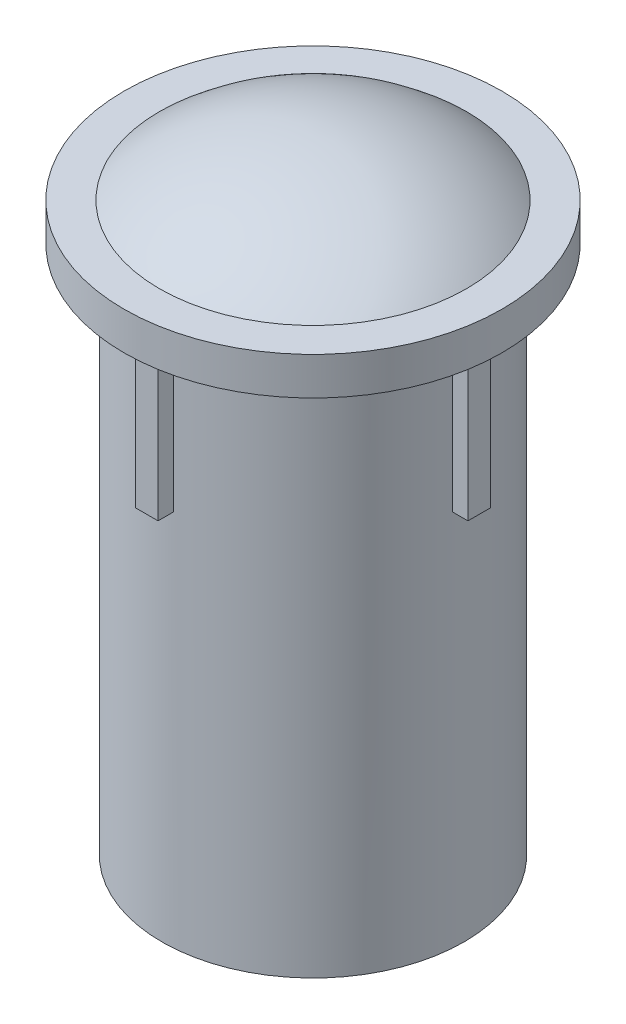
ISO-10303-21;
HEADER;
FILE_DESCRIPTION(('STEP AP214'),'2;1');
FILE_NAME('part.step','',(''),(''),'','','');
FILE_SCHEMA(('AUTOMOTIVE_DESIGN { 1 0 10303 214 1 1 1 1 }'));
ENDSEC;
DATA;
#1=APPLICATION_CONTEXT('core data for automotive mechanical design processes');
#2=APPLICATION_PROTOCOL_DEFINITION('international standard','automotive_design',2000,#1);
#3=PRODUCT_CONTEXT('',#1,'mechanical');
#4=PRODUCT('Part','Part','',(#3));
#5=PRODUCT_RELATED_PRODUCT_CATEGORY('part','',(#4));
#6=PRODUCT_DEFINITION_FORMATION('','',#4);
#7=PRODUCT_DEFINITION_CONTEXT('part definition',#1,'design');
#8=PRODUCT_DEFINITION('design','',#6,#7);
#9=PRODUCT_DEFINITION_SHAPE('','',#8);
#10=(LENGTH_UNIT() NAMED_UNIT(*) SI_UNIT(.MILLI.,.METRE.));
#11=(NAMED_UNIT(*) PLANE_ANGLE_UNIT() SI_UNIT($,.RADIAN.));
#12=(NAMED_UNIT(*) SI_UNIT($,.STERADIAN.) SOLID_ANGLE_UNIT());
#13=UNCERTAINTY_MEASURE_WITH_UNIT(LENGTH_MEASURE(1.E-05),#10,'distance_accuracy_value','');
#14=(GEOMETRIC_REPRESENTATION_CONTEXT(3) GLOBAL_UNCERTAINTY_ASSIGNED_CONTEXT((#13)) GLOBAL_UNIT_ASSIGNED_CONTEXT((#10,
#11,#12)) REPRESENTATION_CONTEXT('',''));
#15=CARTESIAN_POINT('',(0.,0.,0.));
#16=DIRECTION('',(0.,0.,1.));
#17=DIRECTION('',(1.,0.,0.));
#18=AXIS2_PLACEMENT_3D('',#15,#16,#17);
#19=CARTESIAN_POINT('',(0.,0.,0.));
#20=DIRECTION('',(0.,1.,0.));
#21=DIRECTION('',(0.,0.,1.));
#22=AXIS2_PLACEMENT_3D('',#19,#20,#21);
#23=PLANE('',#22);
#24=CARTESIAN_POINT('',(0.,0.,0.));
#25=DIRECTION('',(0.,1.,0.));
#26=DIRECTION('',(0.,0.,1.));
#27=AXIS2_PLACEMENT_3D('',#24,#25,#26);
#28=CIRCLE('',#27,2.5);
#29=CARTESIAN_POINT('',(0.,0.,2.5));
#30=VERTEX_POINT('',#29);
#31=EDGE_CURVE('E246',#30,#30,#28,.T.);
#32=ORIENTED_EDGE('',*,*,#31,.F.);
#33=EDGE_LOOP('',(#32));
#34=FACE_BOUND('',#33,.T.);
#35=DIRECTION('',(0.,0.,1.));
#36=VECTOR('',#35,1.);
#37=CARTESIAN_POINT('',(0.149999999999977,0.,-2.2));
#38=LINE('',#37,#36);
#39=CARTESIAN_POINT('',(0.149999999999977,0.,-2.2));
#40=VERTEX_POINT('',#39);
#41=CARTESIAN_POINT('',(0.149999999999979,0.,-1.99436706751791));
#42=VERTEX_POINT('',#41);
#43=EDGE_CURVE('E50',#40,#42,#38,.T.);
#44=ORIENTED_EDGE('',*,*,#43,.F.);
#45=DIRECTION('',(1.,0.,0.));
#46=VECTOR('',#45,1.);
#47=CARTESIAN_POINT('',(0.149999999999977,0.,-2.2));
#48=LINE('',#47,#46);
#49=CARTESIAN_POINT('',(-0.150000000000023,0.,-2.2));
#50=VERTEX_POINT('',#49);
#51=EDGE_CURVE('E55',#50,#40,#48,.T.);
#52=ORIENTED_EDGE('',*,*,#51,.F.);
#53=DIRECTION('',(0.,0.,-1.));
#54=VECTOR('',#53,1.);
#55=CARTESIAN_POINT('',(-0.150000000000023,0.,-2.2));
#56=LINE('',#55,#54);
#57=CARTESIAN_POINT('',(-0.150000000000021,0.,-1.99436706751791));
#58=VERTEX_POINT('',#57);
#59=EDGE_CURVE('E163',#58,#50,#56,.T.);
#60=ORIENTED_EDGE('',*,*,#59,.F.);
#61=CARTESIAN_POINT('',(0.,0.,0.));
#62=DIRECTION('',(0.,1.,0.));
#63=DIRECTION('',(0.,0.,1.));
#64=AXIS2_PLACEMENT_3D('',#61,#62,#63);
#65=CIRCLE('',#64,2.);
#66=CARTESIAN_POINT('',(-1.99436706751791,0.,-0.15));
#67=VERTEX_POINT('',#66);
#68=EDGE_CURVE('E253',#67,#58,#65,.F.);
#69=ORIENTED_EDGE('',*,*,#68,.F.);
#70=DIRECTION('',(1.,0.,0.));
#71=VECTOR('',#70,1.);
#72=CARTESIAN_POINT('',(-2.2,0.,-0.15));
#73=LINE('',#72,#71);
#74=CARTESIAN_POINT('',(-2.2,0.,-0.15));
#75=VERTEX_POINT('',#74);
#76=EDGE_CURVE('E230',#75,#67,#73,.T.);
#77=ORIENTED_EDGE('',*,*,#76,.F.);
#78=DIRECTION('',(0.,0.,-1.));
#79=VECTOR('',#78,1.);
#80=CARTESIAN_POINT('',(-2.2,0.,-0.15));
#81=LINE('',#80,#79);
#82=CARTESIAN_POINT('',(-2.2,0.,0.15));
#83=VERTEX_POINT('',#82);
#84=EDGE_CURVE('E217',#83,#75,#81,.T.);
#85=ORIENTED_EDGE('',*,*,#84,.F.);
#86=DIRECTION('',(-1.,0.,0.));
#87=VECTOR('',#86,1.);
#88=CARTESIAN_POINT('',(-2.2,0.,0.15));
#89=LINE('',#88,#87);
#90=CARTESIAN_POINT('',(-1.99436706751791,0.,0.15));
#91=VERTEX_POINT('',#90);
#92=EDGE_CURVE('E222',#91,#83,#89,.T.);
#93=ORIENTED_EDGE('',*,*,#92,.F.);
#94=CARTESIAN_POINT('',(-0.149999999999993,0.,1.99436706751791));
#95=VERTEX_POINT('',#94);
#96=EDGE_CURVE('E250',#95,#91,#65,.F.);
#97=ORIENTED_EDGE('',*,*,#96,.F.);
#98=DIRECTION('',(0.,0.,-1.));
#99=VECTOR('',#98,1.);
#100=CARTESIAN_POINT('',(-0.149999999999992,0.,2.2));
#101=LINE('',#100,#99);
#102=CARTESIAN_POINT('',(-0.149999999999992,0.,2.2));
#103=VERTEX_POINT('',#102);
#104=EDGE_CURVE('E207',#103,#95,#101,.T.);
#105=ORIENTED_EDGE('',*,*,#104,.F.);
#106=DIRECTION('',(-1.,0.,0.));
#107=VECTOR('',#106,1.);
#108=CARTESIAN_POINT('',(-0.149999999999992,0.,2.2));
#109=LINE('',#108,#107);
#110=CARTESIAN_POINT('',(0.150000000000008,0.,2.2));
#111=VERTEX_POINT('',#110);
#112=EDGE_CURVE('E194',#111,#103,#109,.T.);
#113=ORIENTED_EDGE('',*,*,#112,.F.);
#114=DIRECTION('',(0.,0.,1.));
#115=VECTOR('',#114,1.);
#116=CARTESIAN_POINT('',(0.150000000000008,0.,2.2));
#117=LINE('',#116,#115);
#118=CARTESIAN_POINT('',(0.150000000000007,0.,1.99436706751791));
#119=VERTEX_POINT('',#118);
#120=EDGE_CURVE('E199',#119,#111,#117,.T.);
#121=ORIENTED_EDGE('',*,*,#120,.F.);
#122=CARTESIAN_POINT('',(1.99436706751791,0.,0.149999999999986));
#123=VERTEX_POINT('',#122);
#124=EDGE_CURVE('E467',#123,#119,#65,.F.);
#125=ORIENTED_EDGE('',*,*,#124,.F.);
#126=DIRECTION('',(-1.,0.,0.));
#127=VECTOR('',#126,1.);
#128=CARTESIAN_POINT('',(2.2,0.,0.149999999999985));
#129=LINE('',#128,#127);
#130=CARTESIAN_POINT('',(2.2,0.,0.149999999999985));
#131=VERTEX_POINT('',#130);
#132=EDGE_CURVE('E170',#131,#123,#129,.T.);
#133=ORIENTED_EDGE('',*,*,#132,.F.);
#134=DIRECTION('',(0.,0.,1.));
#135=VECTOR('',#134,1.);
#136=CARTESIAN_POINT('',(2.2,0.,0.149999999999985));
#137=LINE('',#136,#135);
#138=CARTESIAN_POINT('',(2.2,0.,-0.150000000000015));
#139=VERTEX_POINT('',#138);
#140=EDGE_CURVE('E166',#139,#131,#137,.T.);
#141=ORIENTED_EDGE('',*,*,#140,.F.);
#142=DIRECTION('',(1.,0.,0.));
#143=VECTOR('',#142,1.);
#144=CARTESIAN_POINT('',(2.2,0.,-0.150000000000015));
#145=LINE('',#144,#143);
#146=CARTESIAN_POINT('',(1.99436706751791,0.,-0.150000000000014));
#147=VERTEX_POINT('',#146);
#148=EDGE_CURVE('E179',#147,#139,#145,.T.);
#149=ORIENTED_EDGE('',*,*,#148,.F.);
#150=EDGE_CURVE('E257',#42,#147,#65,.F.);
#151=ORIENTED_EDGE('',*,*,#150,.F.);
#152=EDGE_LOOP('',(#44,#52,#60,#69,#77,#85,#93,#97,#105,#113,#121,#125,#133,#141,#149,#151));
#153=FACE_BOUND('',#152,.T.);
#154=ADVANCED_FACE('F35',(#34,#153),#23,.F.);
#155=CARTESIAN_POINT('',(0.,-7.,0.));
#156=DIRECTION('',(0.,1.,0.));
#157=DIRECTION('',(0.,0.,1.));
#158=AXIS2_PLACEMENT_3D('',#155,#156,#157);
#159=CYLINDRICAL_SURFACE('',#158,2.);
#160=CARTESIAN_POINT('',(0.,-7.,0.));
#161=DIRECTION('',(0.,-1.,0.));
#162=DIRECTION('',(0.,0.,-1.));
#163=AXIS2_PLACEMENT_3D('',#160,#161,#162);
#164=CIRCLE('',#163,2.);
#165=CARTESIAN_POINT('',(0.,-7.,-2.));
#166=VERTEX_POINT('',#165);
#167=EDGE_CURVE('E240',#166,#166,#164,.T.);
#168=ORIENTED_EDGE('',*,*,#167,.F.);
#169=EDGE_LOOP('',(#168));
#170=FACE_BOUND('',#169,.T.);
#171=DIRECTION('',(0.,1.,0.));
#172=VECTOR('',#171,1.);
#173=CARTESIAN_POINT('',(0.149999999999979,-7.,-1.99436706751791));
#174=LINE('',#173,#172);
#175=CARTESIAN_POINT('',(0.149999999999979,-2.,-1.99436706751791));
#176=VERTEX_POINT('',#175);
#177=EDGE_CURVE('E11',#42,#176,#174,.F.);
#178=ORIENTED_EDGE('',*,*,#177,.F.);
#179=ORIENTED_EDGE('',*,*,#150,.T.);
#180=DIRECTION('',(0.,1.,0.));
#181=VECTOR('',#180,1.);
#182=CARTESIAN_POINT('',(1.99436706751791,-7.,-0.150000000000014));
#183=LINE('',#182,#181);
#184=CARTESIAN_POINT('',(1.99436706751791,-2.,-0.150000000000014));
#185=VERTEX_POINT('',#184);
#186=EDGE_CURVE('E278',#185,#147,#183,.T.);
#187=ORIENTED_EDGE('',*,*,#186,.F.);
#188=CARTESIAN_POINT('',(0.,-2.,0.));
#189=DIRECTION('',(0.,1.,0.));
#190=DIRECTION('',(0.,0.,1.));
#191=AXIS2_PLACEMENT_3D('',#188,#189,#190);
#192=CIRCLE('',#191,2.);
#193=CARTESIAN_POINT('',(1.99436706751791,-2.,0.149999999999986));
#194=VERTEX_POINT('',#193);
#195=EDGE_CURVE('E275',#194,#185,#192,.T.);
#196=ORIENTED_EDGE('',*,*,#195,.F.);
#197=DIRECTION('',(0.,1.,0.));
#198=VECTOR('',#197,1.);
#199=CARTESIAN_POINT('',(1.99436706751791,-7.,0.149999999999986));
#200=LINE('',#199,#198);
#201=EDGE_CURVE('E281',#123,#194,#200,.F.);
#202=ORIENTED_EDGE('',*,*,#201,.F.);
#203=ORIENTED_EDGE('',*,*,#124,.T.);
#204=DIRECTION('',(0.,1.,0.));
#205=VECTOR('',#204,1.);
#206=CARTESIAN_POINT('',(0.150000000000007,-7.,1.99436706751791));
#207=LINE('',#206,#205);
#208=CARTESIAN_POINT('',(0.150000000000007,-2.,1.99436706751791));
#209=VERTEX_POINT('',#208);
#210=EDGE_CURVE('E269',#209,#119,#207,.T.);
#211=ORIENTED_EDGE('',*,*,#210,.F.);
#212=CARTESIAN_POINT('',(0.,-2.,0.));
#213=DIRECTION('',(0.,1.,0.));
#214=DIRECTION('',(0.,0.,1.));
#215=AXIS2_PLACEMENT_3D('',#212,#213,#214);
#216=CIRCLE('',#215,2.);
#217=CARTESIAN_POINT('',(-0.149999999999993,-2.,1.99436706751791));
#218=VERTEX_POINT('',#217);
#219=EDGE_CURVE('E266',#218,#209,#216,.T.);
#220=ORIENTED_EDGE('',*,*,#219,.F.);
#221=DIRECTION('',(0.,1.,0.));
#222=VECTOR('',#221,1.);
#223=CARTESIAN_POINT('',(-0.149999999999993,-7.,1.99436706751791));
#224=LINE('',#223,#222);
#225=EDGE_CURVE('E272',#95,#218,#224,.F.);
#226=ORIENTED_EDGE('',*,*,#225,.F.);
#227=ORIENTED_EDGE('',*,*,#96,.T.);
#228=DIRECTION('',(0.,1.,0.));
#229=VECTOR('',#228,1.);
#230=CARTESIAN_POINT('',(-1.99436706751791,-7.,0.15));
#231=LINE('',#230,#229);
#232=CARTESIAN_POINT('',(-1.99436706751791,-2.,0.15));
#233=VERTEX_POINT('',#232);
#234=EDGE_CURVE('E260',#233,#91,#231,.T.);
#235=ORIENTED_EDGE('',*,*,#234,.F.);
#236=CARTESIAN_POINT('',(0.,-2.,0.));
#237=DIRECTION('',(0.,1.,0.));
#238=DIRECTION('',(0.,0.,1.));
#239=AXIS2_PLACEMENT_3D('',#236,#237,#238);
#240=CIRCLE('',#239,2.);
#241=CARTESIAN_POINT('',(-1.99436706751791,-2.,-0.15));
#242=VERTEX_POINT('',#241);
#243=EDGE_CURVE('E256',#242,#233,#240,.T.);
#244=ORIENTED_EDGE('',*,*,#243,.F.);
#245=DIRECTION('',(0.,1.,0.));
#246=VECTOR('',#245,1.);
#247=CARTESIAN_POINT('',(-1.99436706751791,-7.,-0.15));
#248=LINE('',#247,#246);
#249=EDGE_CURVE('E263',#67,#242,#248,.F.);
#250=ORIENTED_EDGE('',*,*,#249,.F.);
#251=ORIENTED_EDGE('',*,*,#68,.T.);
#252=DIRECTION('',(0.,1.,0.));
#253=VECTOR('',#252,1.);
#254=CARTESIAN_POINT('',(-0.150000000000021,-7.,-1.99436706751791));
#255=LINE('',#254,#253);
#256=CARTESIAN_POINT('',(-0.150000000000021,-2.,-1.99436706751791));
#257=VERTEX_POINT('',#256);
#258=EDGE_CURVE('E43',#257,#58,#255,.T.);
#259=ORIENTED_EDGE('',*,*,#258,.F.);
#260=CARTESIAN_POINT('',(0.,-2.,0.));
#261=DIRECTION('',(0.,1.,0.));
#262=DIRECTION('',(0.,0.,1.));
#263=AXIS2_PLACEMENT_3D('',#260,#261,#262);
#264=CIRCLE('',#263,2.);
#265=EDGE_CURVE('E284',#176,#257,#264,.T.);
#266=ORIENTED_EDGE('',*,*,#265,.F.);
#267=EDGE_LOOP('',(#178,#179,#187,#196,#202,#203,#211,#220,#226,#227,#235,#244,#250,#251,#259,#266));
#268=FACE_BOUND('',#267,.T.);
#269=ADVANCED_FACE('F289',(#170,#268),#159,.T.);
#270=CARTESIAN_POINT('',(0.,0.5,0.));
#271=DIRECTION('',(0.,-1.,0.));
#272=DIRECTION('',(0.,0.,-1.));
#273=AXIS2_PLACEMENT_3D('',#270,#271,#272);
#274=CYLINDRICAL_SURFACE('',#273,2.5);
#275=CARTESIAN_POINT('',(0.,0.5,0.));
#276=DIRECTION('',(0.,1.,0.));
#277=DIRECTION('',(0.,0.,1.));
#278=AXIS2_PLACEMENT_3D('',#275,#276,#277);
#279=CIRCLE('',#278,2.5);
#280=CARTESIAN_POINT('',(0.,0.5,2.5));
#281=VERTEX_POINT('',#280);
#282=EDGE_CURVE('E247',#281,#281,#279,.T.);
#283=ORIENTED_EDGE('',*,*,#282,.F.);
#284=EDGE_LOOP('',(#283));
#285=FACE_BOUND('',#284,.T.);
#286=ORIENTED_EDGE('',*,*,#31,.T.);
#287=EDGE_LOOP('',(#286));
#288=FACE_BOUND('',#287,.T.);
#289=ADVANCED_FACE('F37',(#285,#288),#274,.T.);
#290=CARTESIAN_POINT('',(0.,0.5,0.));
#291=DIRECTION('',(0.,1.,0.));
#292=DIRECTION('',(0.,0.,1.));
#293=AXIS2_PLACEMENT_3D('',#290,#291,#292);
#294=PLANE('',#293);
#295=CARTESIAN_POINT('',(0.,0.5,0.));
#296=DIRECTION('',(0.,1.,0.));
#297=DIRECTION('',(0.,0.,1.));
#298=AXIS2_PLACEMENT_3D('',#295,#296,#297);
#299=CIRCLE('',#298,2.03100960115899);
#300=CARTESIAN_POINT('',(0.,0.5,2.03100960115899));
#301=VERTEX_POINT('',#300);
#302=EDGE_CURVE('E243',#301,#301,#299,.F.);
#303=ORIENTED_EDGE('',*,*,#302,.T.);
#304=EDGE_LOOP('',(#303));
#305=FACE_BOUND('',#304,.T.);
#306=ORIENTED_EDGE('',*,*,#282,.T.);
#307=EDGE_LOOP('',(#306));
#308=FACE_BOUND('',#307,.T.);
#309=ADVANCED_FACE('F327',(#305,#308),#294,.T.);
#310=CARTESIAN_POINT('',(0.,-1.875,0.));
#311=DIRECTION('',(0.,1.,0.));
#312=DIRECTION('',(1.,0.,0.));
#313=AXIS2_PLACEMENT_3D('',#310,#311,#312);
#314=SPHERICAL_SURFACE('',#313,3.125);
#315=ORIENTED_EDGE('',*,*,#302,.F.);
#316=EDGE_LOOP('',(#315));
#317=FACE_BOUND('',#316,.T.);
#318=ADVANCED_FACE('F330',(#317),#314,.T.);
#319=CARTESIAN_POINT('',(0.,-7.,0.));
#320=DIRECTION('',(0.,-1.,0.));
#321=DIRECTION('',(0.,0.,-1.));
#322=AXIS2_PLACEMENT_3D('',#319,#320,#321);
#323=PLANE('',#322);
#324=ORIENTED_EDGE('',*,*,#167,.T.);
#325=EDGE_LOOP('',(#324));
#326=FACE_BOUND('',#325,.T.);
#327=ADVANCED_FACE('F333',(#326),#323,.T.);
#328=CARTESIAN_POINT('',(-2.2,-2.,-0.15));
#329=DIRECTION('',(0.,0.,1.));
#330=DIRECTION('',(1.,0.,0.));
#331=AXIS2_PLACEMENT_3D('',#328,#329,#330);
#332=PLANE('',#331);
#333=ORIENTED_EDGE('',*,*,#76,.T.);
#334=ORIENTED_EDGE('',*,*,#249,.T.);
#335=DIRECTION('',(1.,0.,0.));
#336=VECTOR('',#335,1.);
#337=CARTESIAN_POINT('',(-2.2,-2.,-0.15));
#338=LINE('',#337,#336);
#339=CARTESIAN_POINT('',(-2.2,-2.,-0.15));
#340=VERTEX_POINT('',#339);
#341=EDGE_CURVE('E221',#340,#242,#338,.T.);
#342=ORIENTED_EDGE('',*,*,#341,.F.);
#343=DIRECTION('',(0.,1.,0.));
#344=VECTOR('',#343,1.);
#345=CARTESIAN_POINT('',(-2.2,-2.,-0.15));
#346=LINE('',#345,#344);
#347=EDGE_CURVE('E237',#340,#75,#346,.T.);
#348=ORIENTED_EDGE('',*,*,#347,.T.);
#349=EDGE_LOOP('',(#333,#334,#342,#348));
#350=FACE_BOUND('',#349,.T.);
#351=ADVANCED_FACE('F292',(#350),#332,.F.);
#352=CARTESIAN_POINT('',(-2.2,-2.,0.15));
#353=DIRECTION('',(0.,0.,-1.));
#354=DIRECTION('',(-1.,0.,0.));
#355=AXIS2_PLACEMENT_3D('',#352,#353,#354);
#356=PLANE('',#355);
#357=DIRECTION('',(-1.,0.,0.));
#358=VECTOR('',#357,1.);
#359=CARTESIAN_POINT('',(-2.2,-2.,0.15));
#360=LINE('',#359,#358);
#361=CARTESIAN_POINT('',(-2.2,-2.,0.15));
#362=VERTEX_POINT('',#361);
#363=EDGE_CURVE('E225',#233,#362,#360,.T.);
#364=ORIENTED_EDGE('',*,*,#363,.F.);
#365=ORIENTED_EDGE('',*,*,#234,.T.);
#366=ORIENTED_EDGE('',*,*,#92,.T.);
#367=DIRECTION('',(0.,1.,0.));
#368=VECTOR('',#367,1.);
#369=CARTESIAN_POINT('',(-2.2,-2.,0.15));
#370=LINE('',#369,#368);
#371=EDGE_CURVE('E227',#362,#83,#370,.T.);
#372=ORIENTED_EDGE('',*,*,#371,.F.);
#373=EDGE_LOOP('',(#364,#365,#366,#372));
#374=FACE_BOUND('',#373,.T.);
#375=ADVANCED_FACE('F302',(#374),#356,.F.);
#376=CARTESIAN_POINT('',(-2.2,-2.,-0.15));
#377=DIRECTION('',(1.,0.,0.));
#378=DIRECTION('',(0.,0.,-1.));
#379=AXIS2_PLACEMENT_3D('',#376,#377,#378);
#380=PLANE('',#379);
#381=ORIENTED_EDGE('',*,*,#84,.T.);
#382=ORIENTED_EDGE('',*,*,#347,.F.);
#383=DIRECTION('',(0.,0.,-1.));
#384=VECTOR('',#383,1.);
#385=CARTESIAN_POINT('',(-2.2,-2.,-0.15));
#386=LINE('',#385,#384);
#387=EDGE_CURVE('E218',#362,#340,#386,.T.);
#388=ORIENTED_EDGE('',*,*,#387,.F.);
#389=ORIENTED_EDGE('',*,*,#371,.T.);
#390=EDGE_LOOP('',(#381,#382,#388,#389));
#391=FACE_BOUND('',#390,.T.);
#392=ADVANCED_FACE('F296',(#391),#380,.F.);
#393=CARTESIAN_POINT('',(0.,-2.,0.));
#394=DIRECTION('',(0.,1.,0.));
#395=DIRECTION('',(0.,0.,1.));
#396=AXIS2_PLACEMENT_3D('',#393,#394,#395);
#397=PLANE('',#396);
#398=ORIENTED_EDGE('',*,*,#341,.T.);
#399=ORIENTED_EDGE('',*,*,#243,.T.);
#400=ORIENTED_EDGE('',*,*,#363,.T.);
#401=ORIENTED_EDGE('',*,*,#387,.T.);
#402=EDGE_LOOP('',(#398,#399,#400,#401));
#403=FACE_BOUND('',#402,.T.);
#404=ADVANCED_FACE('F304',(#403),#397,.F.);
#405=CARTESIAN_POINT('',(-0.149999999999992,-2.,2.2));
#406=DIRECTION('',(1.,0.,0.));
#407=DIRECTION('',(0.,0.,-1.));
#408=AXIS2_PLACEMENT_3D('',#405,#406,#407);
#409=PLANE('',#408);
#410=ORIENTED_EDGE('',*,*,#104,.T.);
#411=ORIENTED_EDGE('',*,*,#225,.T.);
#412=DIRECTION('',(0.,0.,-1.));
#413=VECTOR('',#412,1.);
#414=CARTESIAN_POINT('',(-0.149999999999992,-2.,2.2));
#415=LINE('',#414,#413);
#416=CARTESIAN_POINT('',(-0.149999999999992,-2.,2.2));
#417=VERTEX_POINT('',#416);
#418=EDGE_CURVE('E198',#417,#218,#415,.T.);
#419=ORIENTED_EDGE('',*,*,#418,.F.);
#420=DIRECTION('',(0.,1.,0.));
#421=VECTOR('',#420,1.);
#422=CARTESIAN_POINT('',(-0.149999999999992,-2.,2.2));
#423=LINE('',#422,#421);
#424=EDGE_CURVE('E214',#417,#103,#423,.T.);
#425=ORIENTED_EDGE('',*,*,#424,.T.);
#426=EDGE_LOOP('',(#410,#411,#419,#425));
#427=FACE_BOUND('',#426,.T.);
#428=ADVANCED_FACE('F306',(#427),#409,.F.);
#429=CARTESIAN_POINT('',(0.150000000000008,-2.,2.2));
#430=DIRECTION('',(-1.,0.,0.));
#431=DIRECTION('',(0.,0.,1.));
#432=AXIS2_PLACEMENT_3D('',#429,#430,#431);
#433=PLANE('',#432);
#434=DIRECTION('',(0.,0.,1.));
#435=VECTOR('',#434,1.);
#436=CARTESIAN_POINT('',(0.150000000000008,-2.,2.2));
#437=LINE('',#436,#435);
#438=CARTESIAN_POINT('',(0.150000000000008,-2.,2.2));
#439=VERTEX_POINT('',#438);
#440=EDGE_CURVE('E202',#209,#439,#437,.T.);
#441=ORIENTED_EDGE('',*,*,#440,.F.);
#442=ORIENTED_EDGE('',*,*,#210,.T.);
#443=ORIENTED_EDGE('',*,*,#120,.T.);
#444=DIRECTION('',(0.,1.,0.));
#445=VECTOR('',#444,1.);
#446=CARTESIAN_POINT('',(0.150000000000008,-2.,2.2));
#447=LINE('',#446,#445);
#448=EDGE_CURVE('E204',#439,#111,#447,.T.);
#449=ORIENTED_EDGE('',*,*,#448,.F.);
#450=EDGE_LOOP('',(#441,#442,#443,#449));
#451=FACE_BOUND('',#450,.T.);
#452=ADVANCED_FACE('F312',(#451),#433,.F.);
#453=CARTESIAN_POINT('',(-0.149999999999992,-2.,2.2));
#454=DIRECTION('',(0.,0.,-1.));
#455=DIRECTION('',(-1.,0.,0.));
#456=AXIS2_PLACEMENT_3D('',#453,#454,#455);
#457=PLANE('',#456);
#458=ORIENTED_EDGE('',*,*,#112,.T.);
#459=ORIENTED_EDGE('',*,*,#424,.F.);
#460=DIRECTION('',(-1.,0.,0.));
#461=VECTOR('',#460,1.);
#462=CARTESIAN_POINT('',(-0.149999999999992,-2.,2.2));
#463=LINE('',#462,#461);
#464=EDGE_CURVE('E195',#439,#417,#463,.T.);
#465=ORIENTED_EDGE('',*,*,#464,.F.);
#466=ORIENTED_EDGE('',*,*,#448,.T.);
#467=EDGE_LOOP('',(#458,#459,#465,#466));
#468=FACE_BOUND('',#467,.T.);
#469=ADVANCED_FACE('F368',(#468),#457,.F.);
#470=CARTESIAN_POINT('',(0.,-2.,0.));
#471=DIRECTION('',(0.,1.,0.));
#472=DIRECTION('',(0.,0.,1.));
#473=AXIS2_PLACEMENT_3D('',#470,#471,#472);
#474=PLANE('',#473);
#475=ORIENTED_EDGE('',*,*,#418,.T.);
#476=ORIENTED_EDGE('',*,*,#219,.T.);
#477=ORIENTED_EDGE('',*,*,#440,.T.);
#478=ORIENTED_EDGE('',*,*,#464,.T.);
#479=EDGE_LOOP('',(#475,#476,#477,#478));
#480=FACE_BOUND('',#479,.T.);
#481=ADVANCED_FACE('F378',(#480),#474,.F.);
#482=CARTESIAN_POINT('',(2.2,-2.,0.149999999999985));
#483=DIRECTION('',(0.,0.,-1.));
#484=DIRECTION('',(-1.,0.,0.));
#485=AXIS2_PLACEMENT_3D('',#482,#483,#484);
#486=PLANE('',#485);
#487=ORIENTED_EDGE('',*,*,#132,.T.);
#488=ORIENTED_EDGE('',*,*,#201,.T.);
#489=DIRECTION('',(-1.,0.,0.));
#490=VECTOR('',#489,1.);
#491=CARTESIAN_POINT('',(2.2,-2.,0.149999999999985));
#492=LINE('',#491,#490);
#493=CARTESIAN_POINT('',(2.2,-2.,0.149999999999985));
#494=VERTEX_POINT('',#493);
#495=EDGE_CURVE('E178',#494,#194,#492,.T.);
#496=ORIENTED_EDGE('',*,*,#495,.F.);
#497=DIRECTION('',(0.,1.,0.));
#498=VECTOR('',#497,1.);
#499=CARTESIAN_POINT('',(2.2,-2.,0.149999999999985));
#500=LINE('',#499,#498);
#501=EDGE_CURVE('E191',#494,#131,#500,.T.);
#502=ORIENTED_EDGE('',*,*,#501,.T.);
#503=EDGE_LOOP('',(#487,#488,#496,#502));
#504=FACE_BOUND('',#503,.T.);
#505=ADVANCED_FACE('F387',(#504),#486,.F.);
#506=CARTESIAN_POINT('',(2.2,-2.,-0.150000000000015));
#507=DIRECTION('',(0.,0.,1.));
#508=DIRECTION('',(1.,0.,0.));
#509=AXIS2_PLACEMENT_3D('',#506,#507,#508);
#510=PLANE('',#509);
#511=DIRECTION('',(1.,0.,0.));
#512=VECTOR('',#511,1.);
#513=CARTESIAN_POINT('',(2.2,-2.,-0.150000000000015));
#514=LINE('',#513,#512);
#515=CARTESIAN_POINT('',(2.2,-2.,-0.150000000000015));
#516=VERTEX_POINT('',#515);
#517=EDGE_CURVE('E182',#185,#516,#514,.T.);
#518=ORIENTED_EDGE('',*,*,#517,.F.);
#519=ORIENTED_EDGE('',*,*,#186,.T.);
#520=ORIENTED_EDGE('',*,*,#148,.T.);
#521=DIRECTION('',(0.,1.,0.));
#522=VECTOR('',#521,1.);
#523=CARTESIAN_POINT('',(2.2,-2.,-0.150000000000015));
#524=LINE('',#523,#522);
#525=EDGE_CURVE('E183',#516,#139,#524,.T.);
#526=ORIENTED_EDGE('',*,*,#525,.F.);
#527=EDGE_LOOP('',(#518,#519,#520,#526));
#528=FACE_BOUND('',#527,.T.);
#529=ADVANCED_FACE('F397',(#528),#510,.F.);
#530=CARTESIAN_POINT('',(2.2,-2.,0.149999999999985));
#531=DIRECTION('',(-1.,0.,0.));
#532=DIRECTION('',(0.,0.,1.));
#533=AXIS2_PLACEMENT_3D('',#530,#531,#532);
#534=PLANE('',#533);
#535=ORIENTED_EDGE('',*,*,#140,.T.);
#536=ORIENTED_EDGE('',*,*,#501,.F.);
#537=DIRECTION('',(0.,0.,1.));
#538=VECTOR('',#537,1.);
#539=CARTESIAN_POINT('',(2.2,-2.,0.149999999999985));
#540=LINE('',#539,#538);
#541=EDGE_CURVE('E175',#516,#494,#540,.T.);
#542=ORIENTED_EDGE('',*,*,#541,.F.);
#543=ORIENTED_EDGE('',*,*,#525,.T.);
#544=EDGE_LOOP('',(#535,#536,#542,#543));
#545=FACE_BOUND('',#544,.T.);
#546=ADVANCED_FACE('F407',(#545),#534,.F.);
#547=CARTESIAN_POINT('',(0.,-2.,0.));
#548=DIRECTION('',(0.,1.,0.));
#549=DIRECTION('',(0.,0.,1.));
#550=AXIS2_PLACEMENT_3D('',#547,#548,#549);
#551=PLANE('',#550);
#552=ORIENTED_EDGE('',*,*,#495,.T.);
#553=ORIENTED_EDGE('',*,*,#195,.T.);
#554=ORIENTED_EDGE('',*,*,#517,.T.);
#555=ORIENTED_EDGE('',*,*,#541,.T.);
#556=EDGE_LOOP('',(#552,#553,#554,#555));
#557=FACE_BOUND('',#556,.T.);
#558=ADVANCED_FACE('F417',(#557),#551,.F.);
#559=CARTESIAN_POINT('',(0.149999999999977,-2.,-2.2));
#560=DIRECTION('',(-1.,0.,0.));
#561=DIRECTION('',(0.,0.,1.));
#562=AXIS2_PLACEMENT_3D('',#559,#560,#561);
#563=PLANE('',#562);
#564=ORIENTED_EDGE('',*,*,#43,.T.);
#565=ORIENTED_EDGE('',*,*,#177,.T.);
#566=DIRECTION('',(0.,0.,1.));
#567=VECTOR('',#566,1.);
#568=CARTESIAN_POINT('',(0.149999999999977,-2.,-2.2));
#569=LINE('',#568,#567);
#570=CARTESIAN_POINT('',(0.149999999999977,-2.,-2.2));
#571=VERTEX_POINT('',#570);
#572=EDGE_CURVE('E147',#571,#176,#569,.T.);
#573=ORIENTED_EDGE('',*,*,#572,.F.);
#574=DIRECTION('',(0.,1.,0.));
#575=VECTOR('',#574,1.);
#576=CARTESIAN_POINT('',(0.149999999999977,-2.,-2.2));
#577=LINE('',#576,#575);
#578=EDGE_CURVE('E151',#571,#40,#577,.T.);
#579=ORIENTED_EDGE('',*,*,#578,.T.);
#580=EDGE_LOOP('',(#564,#565,#573,#579));
#581=FACE_BOUND('',#580,.T.);
#582=ADVANCED_FACE('F149',(#581),#563,.F.);
#583=CARTESIAN_POINT('',(-0.150000000000023,-2.,-2.2));
#584=DIRECTION('',(1.,0.,0.));
#585=DIRECTION('',(0.,0.,-1.));
#586=AXIS2_PLACEMENT_3D('',#583,#584,#585);
#587=PLANE('',#586);
#588=DIRECTION('',(0.,0.,-1.));
#589=VECTOR('',#588,1.);
#590=CARTESIAN_POINT('',(-0.150000000000023,-2.,-2.2));
#591=LINE('',#590,#589);
#592=CARTESIAN_POINT('',(-0.150000000000023,-2.,-2.2));
#593=VERTEX_POINT('',#592);
#594=EDGE_CURVE('E154',#257,#593,#591,.T.);
#595=ORIENTED_EDGE('',*,*,#594,.F.);
#596=ORIENTED_EDGE('',*,*,#258,.T.);
#597=ORIENTED_EDGE('',*,*,#59,.T.);
#598=DIRECTION('',(0.,1.,0.));
#599=VECTOR('',#598,1.);
#600=CARTESIAN_POINT('',(-0.150000000000023,-2.,-2.2));
#601=LINE('',#600,#599);
#602=EDGE_CURVE('E167',#593,#50,#601,.T.);
#603=ORIENTED_EDGE('',*,*,#602,.F.);
#604=EDGE_LOOP('',(#595,#596,#597,#603));
#605=FACE_BOUND('',#604,.T.);
#606=ADVANCED_FACE('F287',(#605),#587,.F.);
#607=CARTESIAN_POINT('',(0.149999999999977,-2.,-2.2));
#608=DIRECTION('',(0.,0.,1.));
#609=DIRECTION('',(1.,0.,0.));
#610=AXIS2_PLACEMENT_3D('',#607,#608,#609);
#611=PLANE('',#610);
#612=ORIENTED_EDGE('',*,*,#51,.T.);
#613=ORIENTED_EDGE('',*,*,#578,.F.);
#614=DIRECTION('',(1.,0.,0.));
#615=VECTOR('',#614,1.);
#616=CARTESIAN_POINT('',(0.149999999999977,-2.,-2.2));
#617=LINE('',#616,#615);
#618=EDGE_CURVE('E155',#593,#571,#617,.T.);
#619=ORIENTED_EDGE('',*,*,#618,.F.);
#620=ORIENTED_EDGE('',*,*,#602,.T.);
#621=EDGE_LOOP('',(#612,#613,#619,#620));
#622=FACE_BOUND('',#621,.T.);
#623=ADVANCED_FACE('F165',(#622),#611,.F.);
#624=CARTESIAN_POINT('',(0.,-2.,0.));
#625=DIRECTION('',(0.,1.,0.));
#626=DIRECTION('',(0.,0.,1.));
#627=AXIS2_PLACEMENT_3D('',#624,#625,#626);
#628=PLANE('',#627);
#629=ORIENTED_EDGE('',*,*,#572,.T.);
#630=ORIENTED_EDGE('',*,*,#265,.T.);
#631=ORIENTED_EDGE('',*,*,#594,.T.);
#632=ORIENTED_EDGE('',*,*,#618,.T.);
#633=EDGE_LOOP('',(#629,#630,#631,#632));
#634=FACE_BOUND('',#633,.T.);
#635=ADVANCED_FACE('F158',(#634),#628,.F.);
#636=CLOSED_SHELL('',(#154,#269,#289,#309,#318,#327,#351,#375,#392,#404,#428,#452,#469,#481,
#505,#529,#546,#558,#582,#606,#623,#635));
#637=MANIFOLD_SOLID_BREP('B2',#636);
#638=ADVANCED_BREP_SHAPE_REPRESENTATION('',(#18,#637),#14);
#639=SHAPE_DEFINITION_REPRESENTATION(#9,#638);
ENDSEC;
END-ISO-10303-21;
